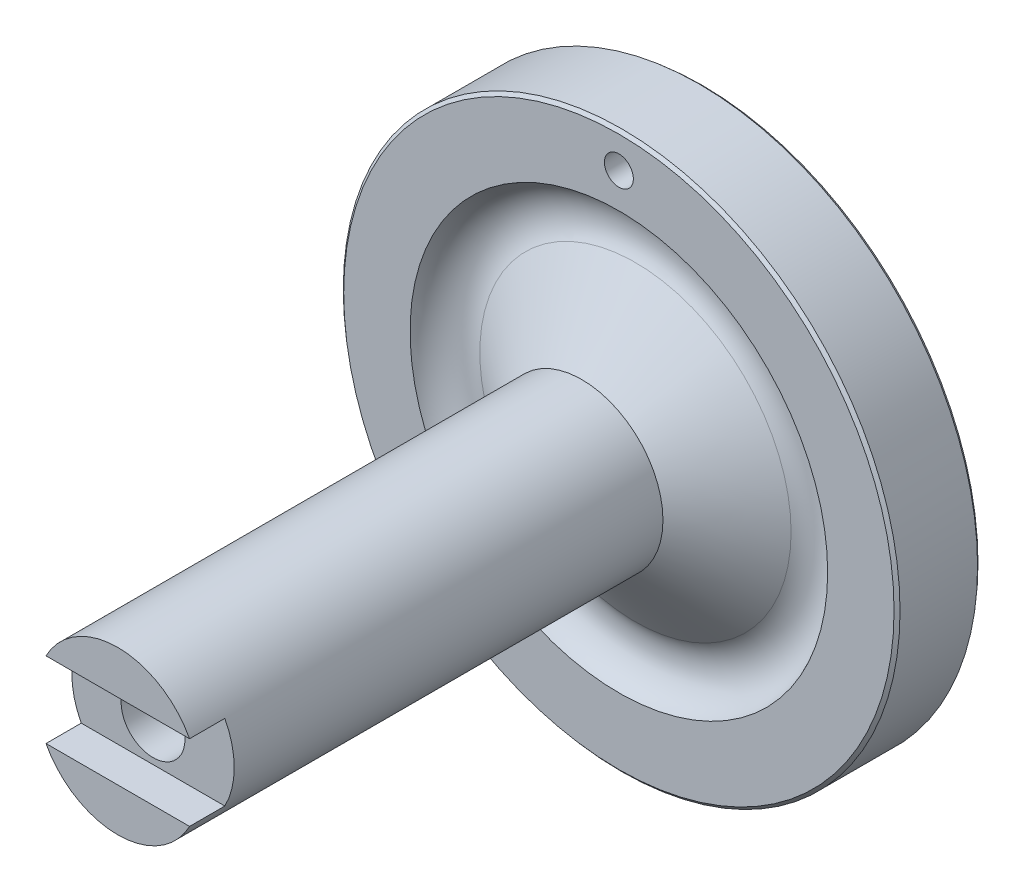
ISO-10303-21;
HEADER;
FILE_DESCRIPTION(('STEP AP214'),'2;1');
FILE_NAME('part.step','',(''),(''),'','','');
FILE_SCHEMA(('AUTOMOTIVE_DESIGN { 1 0 10303 214 1 1 1 1 }'));
ENDSEC;
DATA;
#1=APPLICATION_CONTEXT('core data for automotive mechanical design processes');
#2=APPLICATION_PROTOCOL_DEFINITION('international standard','automotive_design',2000,#1);
#3=PRODUCT_CONTEXT('',#1,'mechanical');
#4=PRODUCT('Part','Part','',(#3));
#5=PRODUCT_RELATED_PRODUCT_CATEGORY('part','',(#4));
#6=PRODUCT_DEFINITION_FORMATION('','',#4);
#7=PRODUCT_DEFINITION_CONTEXT('part definition',#1,'design');
#8=PRODUCT_DEFINITION('design','',#6,#7);
#9=PRODUCT_DEFINITION_SHAPE('','',#8);
#10=(LENGTH_UNIT() NAMED_UNIT(*) SI_UNIT(.MILLI.,.METRE.));
#11=(NAMED_UNIT(*) PLANE_ANGLE_UNIT() SI_UNIT($,.RADIAN.));
#12=(NAMED_UNIT(*) SI_UNIT($,.STERADIAN.) SOLID_ANGLE_UNIT());
#13=UNCERTAINTY_MEASURE_WITH_UNIT(LENGTH_MEASURE(1.E-05),#10,'distance_accuracy_value','');
#14=(GEOMETRIC_REPRESENTATION_CONTEXT(3) GLOBAL_UNCERTAINTY_ASSIGNED_CONTEXT((#13)) GLOBAL_UNIT_ASSIGNED_CONTEXT((#10,
#11,#12)) REPRESENTATION_CONTEXT('',''));
#15=CARTESIAN_POINT('',(0.,0.,0.));
#16=DIRECTION('',(0.,0.,1.));
#17=DIRECTION('',(1.,0.,0.));
#18=AXIS2_PLACEMENT_3D('',#15,#16,#17);
#19=CARTESIAN_POINT('',(0.,8.7376,0.));
#20=DIRECTION('',(0.,0.,-1.));
#21=DIRECTION('',(-1.,0.,0.));
#22=AXIS2_PLACEMENT_3D('',#19,#20,#21);
#23=PLANE('',#22);
#24=CARTESIAN_POINT('',(0.,0.,0.));
#25=DIRECTION('',(0.,0.,1.));
#26=DIRECTION('',(1.,0.,0.));
#27=AXIS2_PLACEMENT_3D('',#24,#25,#26);
#28=CIRCLE('',#27,22.225);
#29=CARTESIAN_POINT('',(19.6475854760833,10.3886,0.));
#30=VERTEX_POINT('',#29);
#31=CARTESIAN_POINT('',(-19.6475854760833,10.3886,0.));
#32=VERTEX_POINT('',#31);
#33=EDGE_CURVE('E161',#30,#32,#28,.T.);
#34=ORIENTED_EDGE('',*,*,#33,.T.);
#35=DIRECTION('',(1.,0.,0.));
#36=VECTOR('',#35,1.);
#37=CARTESIAN_POINT('',(-76.2,10.3886,0.));
#38=LINE('',#37,#36);
#39=EDGE_CURVE('E91',#32,#30,#38,.T.);
#40=ORIENTED_EDGE('',*,*,#39,.T.);
#41=EDGE_LOOP('',(#34,#40));
#42=FACE_BOUND('',#41,.T.);
#43=ADVANCED_FACE('F43',(#42),#23,.F.);
#44=CARTESIAN_POINT('',(0.,0.,0.));
#45=DIRECTION('',(0.,0.,1.));
#46=DIRECTION('',(1.,0.,0.));
#47=AXIS2_PLACEMENT_3D('',#44,#45,#46);
#48=CYLINDRICAL_SURFACE('',#47,22.225);
#49=ORIENTED_EDGE('',*,*,#33,.F.);
#50=DIRECTION('',(0.,0.,1.));
#51=VECTOR('',#50,1.);
#52=CARTESIAN_POINT('',(19.6475854760833,10.3886,0.));
#53=LINE('',#52,#51);
#54=CARTESIAN_POINT('',(19.6475854760833,10.3886,-9.652));
#55=VERTEX_POINT('',#54);
#56=EDGE_CURVE('E69',#30,#55,#53,.F.);
#57=ORIENTED_EDGE('',*,*,#56,.T.);
#58=CARTESIAN_POINT('',(0.,0.,-9.652));
#59=DIRECTION('',(0.,0.,-1.));
#60=DIRECTION('',(0.,1.,0.));
#61=AXIS2_PLACEMENT_3D('',#58,#59,#60);
#62=CIRCLE('',#61,22.225);
#63=CARTESIAN_POINT('',(19.6475854760833,-10.3886,-9.652));
#64=VERTEX_POINT('',#63);
#65=EDGE_CURVE('E104',#55,#64,#62,.T.);
#66=ORIENTED_EDGE('',*,*,#65,.T.);
#67=DIRECTION('',(0.,0.,1.));
#68=VECTOR('',#67,1.);
#69=CARTESIAN_POINT('',(19.6475854760833,-10.3886,0.));
#70=LINE('',#69,#68);
#71=CARTESIAN_POINT('',(19.6475854760833,-10.3886,0.));
#72=VERTEX_POINT('',#71);
#73=EDGE_CURVE('E123',#64,#72,#70,.T.);
#74=ORIENTED_EDGE('',*,*,#73,.T.);
#75=CARTESIAN_POINT('',(-19.6475854760833,-10.3886,0.));
#76=VERTEX_POINT('',#75);
#77=EDGE_CURVE('E160',#76,#72,#28,.T.);
#78=ORIENTED_EDGE('',*,*,#77,.F.);
#79=DIRECTION('',(0.,0.,1.));
#80=VECTOR('',#79,1.);
#81=CARTESIAN_POINT('',(-19.6475854760833,-10.3886,0.));
#82=LINE('',#81,#80);
#83=CARTESIAN_POINT('',(-19.6475854760833,-10.3886,-9.652));
#84=VERTEX_POINT('',#83);
#85=EDGE_CURVE('E61',#76,#84,#82,.F.);
#86=ORIENTED_EDGE('',*,*,#85,.T.);
#87=CARTESIAN_POINT('',(-19.6475854760833,10.3886,-9.652));
#88=VERTEX_POINT('',#87);
#89=EDGE_CURVE('E102',#84,#88,#62,.T.);
#90=ORIENTED_EDGE('',*,*,#89,.T.);
#91=DIRECTION('',(0.,0.,1.));
#92=VECTOR('',#91,1.);
#93=CARTESIAN_POINT('',(-19.6475854760833,10.3886,0.));
#94=LINE('',#93,#92);
#95=EDGE_CURVE('E87',#88,#32,#94,.T.);
#96=ORIENTED_EDGE('',*,*,#95,.T.);
#97=EDGE_LOOP('',(#49,#57,#66,#74,#78,#86,#90,#96));
#98=FACE_BOUND('',#97,.T.);
#99=CARTESIAN_POINT('',(0.,0.,-127.));
#100=DIRECTION('',(0.,0.,1.));
#101=DIRECTION('',(1.,0.,0.));
#102=AXIS2_PLACEMENT_3D('',#99,#100,#101);
#103=CIRCLE('',#102,22.225);
#104=CARTESIAN_POINT('',(22.225,0.,-127.));
#105=VERTEX_POINT('',#104);
#106=EDGE_CURVE('E97',#105,#105,#103,.T.);
#107=ORIENTED_EDGE('',*,*,#106,.T.);
#108=EDGE_LOOP('',(#107));
#109=FACE_BOUND('',#108,.T.);
#110=ADVANCED_FACE('F108',(#98,#109),#48,.T.);
#111=ORIENTED_EDGE('',*,*,#77,.T.);
#112=DIRECTION('',(1.,0.,0.));
#113=VECTOR('',#112,1.);
#114=CARTESIAN_POINT('',(-76.2,-10.3886,0.));
#115=LINE('',#114,#113);
#116=EDGE_CURVE('E119',#76,#72,#115,.T.);
#117=ORIENTED_EDGE('',*,*,#116,.F.);
#118=EDGE_LOOP('',(#111,#117));
#119=FACE_BOUND('',#118,.T.);
#120=ADVANCED_FACE('F215',(#119),#23,.F.);
#121=CARTESIAN_POINT('',(0.,0.,0.));
#122=DIRECTION('',(0.,0.,1.));
#123=DIRECTION('',(1.,0.,0.));
#124=AXIS2_PLACEMENT_3D('',#121,#122,#123);
#125=CYLINDRICAL_SURFACE('',#124,8.7376);
#126=CARTESIAN_POINT('',(0.,0.,-9.652));
#127=DIRECTION('',(0.,0.,-1.));
#128=DIRECTION('',(0.,1.,0.));
#129=AXIS2_PLACEMENT_3D('',#126,#127,#128);
#130=CIRCLE('',#129,8.7376);
#131=CARTESIAN_POINT('',(0.,8.7376,-9.652));
#132=VERTEX_POINT('',#131);
#133=EDGE_CURVE('E112',#132,#132,#130,.F.);
#134=ORIENTED_EDGE('',*,*,#133,.T.);
#135=EDGE_LOOP('',(#134));
#136=FACE_BOUND('',#135,.T.);
#137=CARTESIAN_POINT('',(0.,0.,-152.0952));
#138=DIRECTION('',(0.,0.,1.));
#139=DIRECTION('',(1.,0.,0.));
#140=AXIS2_PLACEMENT_3D('',#137,#138,#139);
#141=CIRCLE('',#140,8.7376);
#142=CARTESIAN_POINT('',(8.7376,0.,-152.0952));
#143=VERTEX_POINT('',#142);
#144=EDGE_CURVE('E156',#143,#143,#141,.T.);
#145=ORIENTED_EDGE('',*,*,#144,.F.);
#146=EDGE_LOOP('',(#145));
#147=FACE_BOUND('',#146,.T.);
#148=ADVANCED_FACE('F222',(#136,#147),#125,.F.);
#149=CARTESIAN_POINT('',(0.,15.875,-152.0952));
#150=DIRECTION('',(0.,0.,1.));
#151=DIRECTION('',(1.,0.,0.));
#152=AXIS2_PLACEMENT_3D('',#149,#150,#151);
#153=PLANE('',#152);
#154=CARTESIAN_POINT('',(0.,0.,-152.0952));
#155=DIRECTION('',(0.,0.,1.));
#156=DIRECTION('',(1.,0.,0.));
#157=AXIS2_PLACEMENT_3D('',#154,#155,#156);
#158=CIRCLE('',#157,15.875);
#159=CARTESIAN_POINT('',(15.875,0.,-152.0952));
#160=VERTEX_POINT('',#159);
#161=EDGE_CURVE('E152',#160,#160,#158,.T.);
#162=ORIENTED_EDGE('',*,*,#161,.F.);
#163=EDGE_LOOP('',(#162));
#164=FACE_BOUND('',#163,.T.);
#165=ORIENTED_EDGE('',*,*,#144,.T.);
#166=EDGE_LOOP('',(#165));
#167=FACE_BOUND('',#166,.T.);
#168=ADVANCED_FACE('F227',(#164,#167),#153,.F.);
#169=CARTESIAN_POINT('',(0.,0.,-152.0952));
#170=DIRECTION('',(0.,0.,1.));
#171=DIRECTION('',(1.,0.,0.));
#172=AXIS2_PLACEMENT_3D('',#169,#170,#171);
#173=CONICAL_SURFACE('',#172,15.875,0.785398163397443);
#174=CARTESIAN_POINT('',(0.,0.,-145.135826502241));
#175=DIRECTION('',(0.,0.,1.));
#176=DIRECTION('',(1.,0.,0.));
#177=AXIS2_PLACEMENT_3D('',#174,#175,#176);
#178=CIRCLE('',#177,22.8343734977594);
#179=CARTESIAN_POINT('',(22.8343734977594,0.,-145.135826502241));
#180=VERTEX_POINT('',#179);
#181=EDGE_CURVE('E148',#180,#180,#178,.T.);
#182=ORIENTED_EDGE('',*,*,#181,.F.);
#183=EDGE_LOOP('',(#182));
#184=FACE_BOUND('',#183,.T.);
#185=ORIENTED_EDGE('',*,*,#161,.T.);
#186=EDGE_LOOP('',(#185));
#187=FACE_BOUND('',#186,.T.);
#188=ADVANCED_FACE('F376',(#184,#187),#173,.T.);
#189=CARTESIAN_POINT('',(0.,0.,-151.871018593042));
#190=DIRECTION('',(0.,0.,1.));
#191=DIRECTION('',(1.,0.,0.));
#192=AXIS2_PLACEMENT_3D('',#189,#190,#191);
#193=TOROIDAL_SURFACE('',#192,29.5695655885613,9.52500000000003);
#194=CARTESIAN_POINT('',(0.,0.,-144.145832257325));
#195=DIRECTION('',(0.,0.,1.));
#196=DIRECTION('',(1.,0.,0.));
#197=AXIS2_PLACEMENT_3D('',#194,#195,#196);
#198=CIRCLE('',#197,35.1415599423308);
#199=CARTESIAN_POINT('',(35.1415599423308,0.,-144.145832257325));
#200=VERTEX_POINT('',#199);
#201=EDGE_CURVE('E144',#200,#200,#198,.T.);
#202=ORIENTED_EDGE('',*,*,#201,.F.);
#203=EDGE_LOOP('',(#202));
#204=FACE_BOUND('',#203,.T.);
#205=ORIENTED_EDGE('',*,*,#181,.T.);
#206=EDGE_LOOP('',(#205));
#207=FACE_BOUND('',#206,.T.);
#208=ADVANCED_FACE('F385',(#204,#207),#193,.F.);
#209=CARTESIAN_POINT('',(0.,0.,-144.145832257325));
#210=DIRECTION('',(0.,0.,-1.));
#211=DIRECTION('',(-1.,0.,0.));
#212=AXIS2_PLACEMENT_3D('',#209,#210,#211);
#213=CONICAL_SURFACE('',#212,35.1415599423308,0.9459331808622);
#214=CARTESIAN_POINT('',(0.,0.,-160.02));
#215=DIRECTION('',(0.,0.,1.));
#216=DIRECTION('',(1.,0.,0.));
#217=AXIS2_PLACEMENT_3D('',#214,#215,#216);
#218=CIRCLE('',#217,57.15);
#219=CARTESIAN_POINT('',(57.15,0.,-160.02));
#220=VERTEX_POINT('',#219);
#221=EDGE_CURVE('E140',#220,#220,#218,.T.);
#222=ORIENTED_EDGE('',*,*,#221,.F.);
#223=EDGE_LOOP('',(#222));
#224=FACE_BOUND('',#223,.T.);
#225=ORIENTED_EDGE('',*,*,#201,.T.);
#226=EDGE_LOOP('',(#225));
#227=FACE_BOUND('',#226,.T.);
#228=ADVANCED_FACE('F291',(#224,#227),#213,.F.);
#229=CARTESIAN_POINT('',(0.,76.2,-160.02));
#230=DIRECTION('',(0.,0.,1.));
#231=DIRECTION('',(1.,0.,0.));
#232=AXIS2_PLACEMENT_3D('',#229,#230,#231);
#233=PLANE('',#232);
#234=CARTESIAN_POINT('',(0.,66.675,-160.02));
#235=DIRECTION('',(0.,0.,-1.));
#236=DIRECTION('',(-1.,0.,0.));
#237=AXIS2_PLACEMENT_3D('',#234,#235,#236);
#238=CIRCLE('',#237,3.9624);
#239=CARTESIAN_POINT('',(-3.9624,66.675,-160.02));
#240=VERTEX_POINT('',#239);
#241=EDGE_CURVE('E237',#240,#240,#238,.T.);
#242=ORIENTED_EDGE('',*,*,#241,.F.);
#243=EDGE_LOOP('',(#242));
#244=FACE_BOUND('',#243,.T.);
#245=CARTESIAN_POINT('',(0.,0.,-160.02));
#246=DIRECTION('',(0.,0.,1.));
#247=DIRECTION('',(1.,0.,0.));
#248=AXIS2_PLACEMENT_3D('',#245,#246,#247);
#249=CIRCLE('',#248,75.438);
#250=CARTESIAN_POINT('',(75.438,0.,-160.02));
#251=VERTEX_POINT('',#250);
#252=EDGE_CURVE('E53',#251,#251,#249,.F.);
#253=ORIENTED_EDGE('',*,*,#252,.T.);
#254=EDGE_LOOP('',(#253));
#255=FACE_BOUND('',#254,.T.);
#256=ORIENTED_EDGE('',*,*,#221,.T.);
#257=EDGE_LOOP('',(#256));
#258=FACE_BOUND('',#257,.T.);
#259=ADVANCED_FACE('F176',(#244,#255,#258),#233,.F.);
#260=CARTESIAN_POINT('',(0.,0.,0.));
#261=DIRECTION('',(0.,0.,1.));
#262=DIRECTION('',(1.,0.,0.));
#263=AXIS2_PLACEMENT_3D('',#260,#261,#262);
#264=CYLINDRICAL_SURFACE('',#263,76.2);
#265=CARTESIAN_POINT('',(0.,0.,-159.143419273698));
#266=DIRECTION('',(0.,0.,1.));
#267=DIRECTION('',(1.,0.,0.));
#268=AXIS2_PLACEMENT_3D('',#265,#266,#267);
#269=CIRCLE('',#268,76.2);
#270=CARTESIAN_POINT('',(76.2,0.,-159.143419273698));
#271=VERTEX_POINT('',#270);
#272=EDGE_CURVE('E168',#271,#271,#269,.T.);
#273=ORIENTED_EDGE('',*,*,#272,.T.);
#274=EDGE_LOOP('',(#273));
#275=FACE_BOUND('',#274,.T.);
#276=CARTESIAN_POINT('',(0.,0.,-137.922));
#277=DIRECTION('',(0.,0.,-1.));
#278=DIRECTION('',(-1.,0.,0.));
#279=AXIS2_PLACEMENT_3D('',#276,#277,#278);
#280=CIRCLE('',#279,76.2);
#281=CARTESIAN_POINT('',(-76.2,0.,-137.922));
#282=VERTEX_POINT('',#281);
#283=EDGE_CURVE('E164',#282,#282,#280,.T.);
#284=ORIENTED_EDGE('',*,*,#283,.T.);
#285=EDGE_LOOP('',(#284));
#286=FACE_BOUND('',#285,.T.);
#287=ADVANCED_FACE('F185',(#275,#286),#264,.T.);
#288=CARTESIAN_POINT('',(0.,57.15,-137.16));
#289=DIRECTION('',(0.,0.,-1.));
#290=DIRECTION('',(-1.,0.,0.));
#291=AXIS2_PLACEMENT_3D('',#288,#289,#290);
#292=PLANE('',#291);
#293=CARTESIAN_POINT('',(0.,66.675,-137.16));
#294=DIRECTION('',(0.,0.,-1.));
#295=DIRECTION('',(-1.,0.,0.));
#296=AXIS2_PLACEMENT_3D('',#293,#294,#295);
#297=CIRCLE('',#296,3.9624);
#298=CARTESIAN_POINT('',(-3.9624,66.675,-137.16));
#299=VERTEX_POINT('',#298);
#300=EDGE_CURVE('E47',#299,#299,#297,.T.);
#301=ORIENTED_EDGE('',*,*,#300,.T.);
#302=EDGE_LOOP('',(#301));
#303=FACE_BOUND('',#302,.T.);
#304=CARTESIAN_POINT('',(0.,0.,-137.16));
#305=DIRECTION('',(0.,0.,-1.));
#306=DIRECTION('',(-1.,0.,0.));
#307=AXIS2_PLACEMENT_3D('',#304,#305,#306);
#308=CIRCLE('',#307,75.3234192736977);
#309=CARTESIAN_POINT('',(-75.3234192736977,0.,-137.16));
#310=VERTEX_POINT('',#309);
#311=EDGE_CURVE('E11',#310,#310,#308,.F.);
#312=ORIENTED_EDGE('',*,*,#311,.T.);
#313=EDGE_LOOP('',(#312));
#314=FACE_BOUND('',#313,.T.);
#315=CARTESIAN_POINT('',(0.,0.,-137.16));
#316=DIRECTION('',(0.,0.,1.));
#317=DIRECTION('',(1.,0.,0.));
#318=AXIS2_PLACEMENT_3D('',#315,#316,#317);
#319=CIRCLE('',#318,57.15);
#320=CARTESIAN_POINT('',(57.15,0.,-137.16));
#321=VERTEX_POINT('',#320);
#322=EDGE_CURVE('E136',#321,#321,#319,.T.);
#323=ORIENTED_EDGE('',*,*,#322,.F.);
#324=EDGE_LOOP('',(#323));
#325=FACE_BOUND('',#324,.T.);
#326=ADVANCED_FACE('F188',(#303,#314,#325),#292,.F.);
#327=CARTESIAN_POINT('',(0.,0.,-133.972413355539));
#328=DIRECTION('',(0.,0.,1.));
#329=DIRECTION('',(1.,0.,0.));
#330=AXIS2_PLACEMENT_3D('',#327,#328,#329);
#331=TOROIDAL_SURFACE('',#330,48.174203857927,9.52500000000003);
#332=CARTESIAN_POINT('',(0.,0.,-141.697599691257));
#333=DIRECTION('',(0.,0.,1.));
#334=DIRECTION('',(1.,0.,0.));
#335=AXIS2_PLACEMENT_3D('',#332,#333,#334);
#336=CIRCLE('',#335,42.6022095041575);
#337=CARTESIAN_POINT('',(42.6022095041575,0.,-141.697599691257));
#338=VERTEX_POINT('',#337);
#339=EDGE_CURVE('E132',#338,#338,#336,.T.);
#340=ORIENTED_EDGE('',*,*,#339,.F.);
#341=EDGE_LOOP('',(#340));
#342=FACE_BOUND('',#341,.T.);
#343=ORIENTED_EDGE('',*,*,#322,.T.);
#344=EDGE_LOOP('',(#343));
#345=FACE_BOUND('',#344,.T.);
#346=ADVANCED_FACE('F198',(#342,#345),#331,.F.);
#347=CARTESIAN_POINT('',(0.,0.,-141.697599691257));
#348=DIRECTION('',(0.,0.,-1.));
#349=DIRECTION('',(-1.,0.,0.));
#350=AXIS2_PLACEMENT_3D('',#347,#348,#349);
#351=CONICAL_SURFACE('',#350,42.6022095041575,0.945933180862199);
#352=ORIENTED_EDGE('',*,*,#106,.F.);
#353=EDGE_LOOP('',(#352));
#354=FACE_BOUND('',#353,.T.);
#355=ORIENTED_EDGE('',*,*,#339,.T.);
#356=EDGE_LOOP('',(#355));
#357=FACE_BOUND('',#356,.T.);
#358=ADVANCED_FACE('F182',(#354,#357),#351,.T.);
#359=CARTESIAN_POINT('',(0.,0.,-159.143419273698));
#360=DIRECTION('',(0.,0.,1.));
#361=DIRECTION('',(1.,0.,0.));
#362=AXIS2_PLACEMENT_3D('',#359,#360,#361);
#363=CONICAL_SURFACE('',#362,76.2,0.71558499331768);
#364=ORIENTED_EDGE('',*,*,#252,.F.);
#365=EDGE_LOOP('',(#364));
#366=FACE_BOUND('',#365,.T.);
#367=ORIENTED_EDGE('',*,*,#272,.F.);
#368=EDGE_LOOP('',(#367));
#369=FACE_BOUND('',#368,.T.);
#370=ADVANCED_FACE('F179',(#366,#369),#363,.T.);
#371=CARTESIAN_POINT('',(0.,0.,-137.16));
#372=DIRECTION('',(0.,0.,-1.));
#373=DIRECTION('',(-1.,0.,0.));
#374=AXIS2_PLACEMENT_3D('',#371,#372,#373);
#375=CONICAL_SURFACE('',#374,75.3234192736977,0.855211333477208);
#376=ORIENTED_EDGE('',*,*,#283,.F.);
#377=EDGE_LOOP('',(#376));
#378=FACE_BOUND('',#377,.T.);
#379=ORIENTED_EDGE('',*,*,#311,.F.);
#380=EDGE_LOOP('',(#379));
#381=FACE_BOUND('',#380,.T.);
#382=ADVANCED_FACE('F45',(#378,#381),#375,.T.);
#383=CARTESIAN_POINT('',(-76.2,10.3886,-9.652));
#384=DIRECTION('',(0.,1.,0.));
#385=DIRECTION('',(0.,0.,1.));
#386=AXIS2_PLACEMENT_3D('',#383,#384,#385);
#387=PLANE('',#386);
#388=DIRECTION('',(1.,0.,0.));
#389=VECTOR('',#388,1.);
#390=CARTESIAN_POINT('',(-76.2,10.3886,-9.652));
#391=LINE('',#390,#389);
#392=EDGE_CURVE('E90',#88,#55,#391,.T.);
#393=ORIENTED_EDGE('',*,*,#392,.T.);
#394=ORIENTED_EDGE('',*,*,#56,.F.);
#395=ORIENTED_EDGE('',*,*,#39,.F.);
#396=ORIENTED_EDGE('',*,*,#95,.F.);
#397=EDGE_LOOP('',(#393,#394,#395,#396));
#398=FACE_BOUND('',#397,.T.);
#399=ADVANCED_FACE('F89',(#398),#387,.F.);
#400=CARTESIAN_POINT('',(-76.2,-10.3886,-9.652));
#401=DIRECTION('',(0.,-1.,0.));
#402=DIRECTION('',(0.,0.,-1.));
#403=AXIS2_PLACEMENT_3D('',#400,#401,#402);
#404=PLANE('',#403);
#405=DIRECTION('',(1.,0.,0.));
#406=VECTOR('',#405,1.);
#407=CARTESIAN_POINT('',(-76.2,-10.3886,-9.652));
#408=LINE('',#407,#406);
#409=EDGE_CURVE('E106',#84,#64,#408,.T.);
#410=ORIENTED_EDGE('',*,*,#409,.F.);
#411=ORIENTED_EDGE('',*,*,#85,.F.);
#412=ORIENTED_EDGE('',*,*,#116,.T.);
#413=ORIENTED_EDGE('',*,*,#73,.F.);
#414=EDGE_LOOP('',(#410,#411,#412,#413));
#415=FACE_BOUND('',#414,.T.);
#416=ADVANCED_FACE('F231',(#415),#404,.F.);
#417=CARTESIAN_POINT('',(-76.2,-10.3886,-9.652));
#418=DIRECTION('',(0.,0.,-1.));
#419=DIRECTION('',(0.,1.,0.));
#420=AXIS2_PLACEMENT_3D('',#417,#418,#419);
#421=PLANE('',#420);
#422=ORIENTED_EDGE('',*,*,#133,.F.);
#423=EDGE_LOOP('',(#422));
#424=FACE_BOUND('',#423,.T.);
#425=ORIENTED_EDGE('',*,*,#392,.F.);
#426=ORIENTED_EDGE('',*,*,#89,.F.);
#427=ORIENTED_EDGE('',*,*,#409,.T.);
#428=ORIENTED_EDGE('',*,*,#65,.F.);
#429=EDGE_LOOP('',(#425,#426,#427,#428));
#430=FACE_BOUND('',#429,.T.);
#431=ADVANCED_FACE('F100',(#424,#430),#421,.F.);
#432=CARTESIAN_POINT('',(0.,66.675,0.));
#433=DIRECTION('',(0.,0.,-1.));
#434=DIRECTION('',(-1.,0.,0.));
#435=AXIS2_PLACEMENT_3D('',#432,#433,#434);
#436=CYLINDRICAL_SURFACE('',#435,3.9624);
#437=ORIENTED_EDGE('',*,*,#241,.T.);
#438=EDGE_LOOP('',(#437));
#439=FACE_BOUND('',#438,.T.);
#440=ORIENTED_EDGE('',*,*,#300,.F.);
#441=EDGE_LOOP('',(#440));
#442=FACE_BOUND('',#441,.T.);
#443=ADVANCED_FACE('F246',(#439,#442),#436,.F.);
#444=CLOSED_SHELL('',(#43,#110,#120,#148,#168,#188,#208,#228,#259,#287,#326,#346,#358,#370,#382,
#399,#416,#431,#443));
#445=MANIFOLD_SOLID_BREP('B2',#444);
#446=ADVANCED_BREP_SHAPE_REPRESENTATION('',(#18,#445),#14);
#447=SHAPE_DEFINITION_REPRESENTATION(#9,#446);
ENDSEC;
END-ISO-10303-21;
